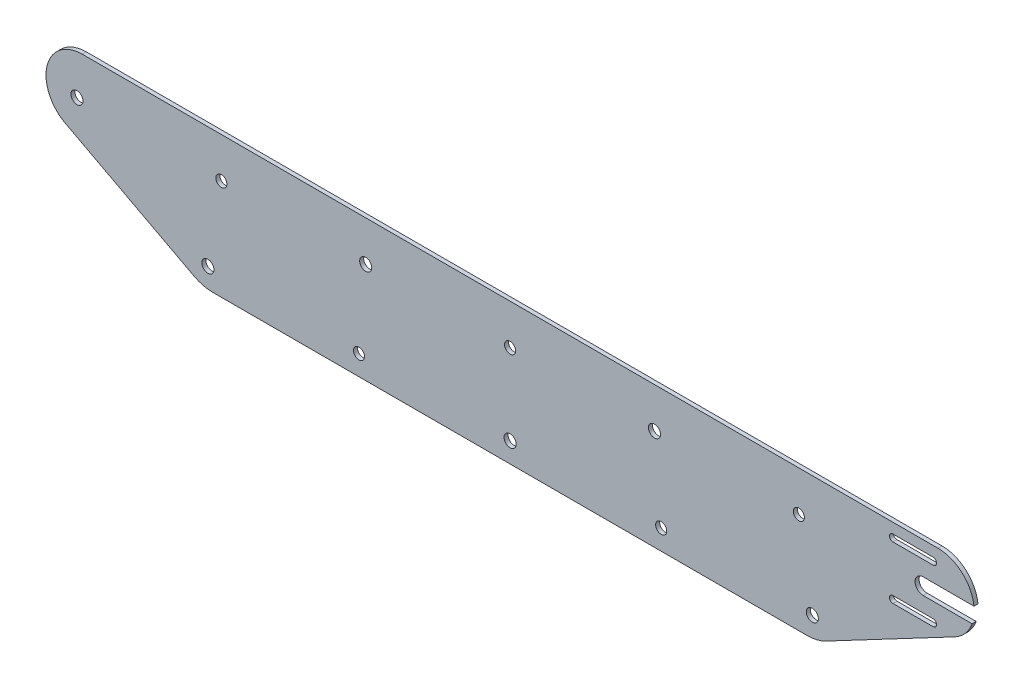
ISO-10303-21;
HEADER;
FILE_DESCRIPTION(('STEP AP214'),'2;1');
FILE_NAME('part.step','',(''),(''),'','','');
FILE_SCHEMA(('AUTOMOTIVE_DESIGN { 1 0 10303 214 1 1 1 1 }'));
ENDSEC;
DATA;
#1=APPLICATION_CONTEXT('core data for automotive mechanical design processes');
#2=APPLICATION_PROTOCOL_DEFINITION('international standard','automotive_design',2000,#1);
#3=PRODUCT_CONTEXT('',#1,'mechanical');
#4=PRODUCT('Part','Part','',(#3));
#5=PRODUCT_RELATED_PRODUCT_CATEGORY('part','',(#4));
#6=PRODUCT_DEFINITION_FORMATION('','',#4);
#7=PRODUCT_DEFINITION_CONTEXT('part definition',#1,'design');
#8=PRODUCT_DEFINITION('design','',#6,#7);
#9=PRODUCT_DEFINITION_SHAPE('','',#8);
#10=(LENGTH_UNIT() NAMED_UNIT(*) SI_UNIT(.MILLI.,.METRE.));
#11=(NAMED_UNIT(*) PLANE_ANGLE_UNIT() SI_UNIT($,.RADIAN.));
#12=(NAMED_UNIT(*) SI_UNIT($,.STERADIAN.) SOLID_ANGLE_UNIT());
#13=UNCERTAINTY_MEASURE_WITH_UNIT(LENGTH_MEASURE(1.E-05),#10,'distance_accuracy_value','');
#14=(GEOMETRIC_REPRESENTATION_CONTEXT(3) GLOBAL_UNCERTAINTY_ASSIGNED_CONTEXT((#13)) GLOBAL_UNIT_ASSIGNED_CONTEXT((#10,
#11,#12)) REPRESENTATION_CONTEXT('',''));
#15=CARTESIAN_POINT('',(0.,0.,0.));
#16=DIRECTION('',(0.,0.,1.));
#17=DIRECTION('',(1.,0.,0.));
#18=AXIS2_PLACEMENT_3D('',#15,#16,#17);
#19=CARTESIAN_POINT('',(0.,0.,2.));
#20=DIRECTION('',(0.,0.,-1.));
#21=DIRECTION('',(-1.,0.,0.));
#22=AXIS2_PLACEMENT_3D('',#19,#20,#21);
#23=PLANE('',#22);
#24=CARTESIAN_POINT('',(-74.9999999999999,-20.,2.));
#25=DIRECTION('',(0.,0.,1.));
#26=DIRECTION('',(1.,0.,0.));
#27=AXIS2_PLACEMENT_3D('',#24,#25,#26);
#28=CIRCLE('',#27,2.75);
#29=CARTESIAN_POINT('',(-72.2499999999999,-20.,2.));
#30=VERTEX_POINT('',#29);
#31=EDGE_CURVE('E754',#30,#30,#28,.T.);
#32=ORIENTED_EDGE('',*,*,#31,.F.);
#33=EDGE_LOOP('',(#32));
#34=FACE_BOUND('',#33,.T.);
#35=CARTESIAN_POINT('',(-143.333333333333,20.,2.));
#36=DIRECTION('',(0.,0.,-1.));
#37=DIRECTION('',(-1.,0.,0.));
#38=AXIS2_PLACEMENT_3D('',#35,#36,#37);
#39=CIRCLE('',#38,2.74999999999997);
#40=CARTESIAN_POINT('',(-146.083333333333,20.,2.));
#41=VERTEX_POINT('',#40);
#42=EDGE_CURVE('E760',#41,#41,#39,.T.);
#43=ORIENTED_EDGE('',*,*,#42,.T.);
#44=EDGE_LOOP('',(#43));
#45=FACE_BOUND('',#44,.T.);
#46=CARTESIAN_POINT('',(0.,20.,2.));
#47=DIRECTION('',(0.,0.,-1.));
#48=DIRECTION('',(-1.,0.,0.));
#49=AXIS2_PLACEMENT_3D('',#46,#47,#48);
#50=CIRCLE('',#49,2.74999999999999);
#51=CARTESIAN_POINT('',(-2.75000000000003,20.,2.));
#52=VERTEX_POINT('',#51);
#53=EDGE_CURVE('E766',#52,#52,#50,.T.);
#54=ORIENTED_EDGE('',*,*,#53,.T.);
#55=EDGE_LOOP('',(#54));
#56=FACE_BOUND('',#55,.T.);
#57=CARTESIAN_POINT('',(143.333333333333,20.,2.));
#58=DIRECTION('',(0.,0.,-1.));
#59=DIRECTION('',(-1.,0.,0.));
#60=AXIS2_PLACEMENT_3D('',#57,#58,#59);
#61=CIRCLE('',#60,2.74999999999997);
#62=CARTESIAN_POINT('',(140.583333333333,20.,2.));
#63=VERTEX_POINT('',#62);
#64=EDGE_CURVE('E251',#63,#63,#61,.T.);
#65=ORIENTED_EDGE('',*,*,#64,.T.);
#66=EDGE_LOOP('',(#65));
#67=FACE_BOUND('',#66,.T.);
#68=DIRECTION('',(-1.,0.,0.));
#69=VECTOR('',#68,1.);
#70=CARTESIAN_POINT('',(0.,5.07124344467712,2.));
#71=LINE('',#70,#69);
#72=CARTESIAN_POINT('',(210.,5.07124344467712,2.));
#73=VERTEX_POINT('',#72);
#74=CARTESIAN_POINT('',(190.,5.07124344467712,2.));
#75=VERTEX_POINT('',#74);
#76=EDGE_CURVE('E264',#73,#75,#71,.T.);
#77=ORIENTED_EDGE('',*,*,#76,.T.);
#78=CARTESIAN_POINT('',(190.,6.7712434446771,2.));
#79=DIRECTION('',(0.,0.,-1.));
#80=DIRECTION('',(-1.,0.,0.));
#81=AXIS2_PLACEMENT_3D('',#78,#79,#80);
#82=CIRCLE('',#81,1.69999999999998);
#83=CARTESIAN_POINT('',(190.,8.47124344467708,2.));
#84=VERTEX_POINT('',#83);
#85=EDGE_CURVE('E243',#84,#75,#82,.F.);
#86=ORIENTED_EDGE('',*,*,#85,.F.);
#87=DIRECTION('',(1.,0.,0.));
#88=VECTOR('',#87,1.);
#89=CARTESIAN_POINT('',(0.,8.47124344467722,2.));
#90=LINE('',#89,#88);
#91=CARTESIAN_POINT('',(210.,8.47124344467707,2.));
#92=VERTEX_POINT('',#91);
#93=EDGE_CURVE('E233',#84,#92,#90,.T.);
#94=ORIENTED_EDGE('',*,*,#93,.T.);
#95=CARTESIAN_POINT('',(210.,6.7712434446771,2.));
#96=DIRECTION('',(0.,0.,-1.));
#97=DIRECTION('',(-1.,0.,0.));
#98=AXIS2_PLACEMENT_3D('',#95,#96,#97);
#99=CIRCLE('',#98,1.69999999999998);
#100=EDGE_CURVE('E261',#92,#73,#99,.T.);
#101=ORIENTED_EDGE('',*,*,#100,.T.);
#102=EDGE_LOOP('',(#77,#86,#94,#101));
#103=FACE_BOUND('',#102,.T.);
#104=DIRECTION('',(1.,0.,0.));
#105=VECTOR('',#104,1.);
#106=CARTESIAN_POINT('',(0.,34.928756555323,2.));
#107=LINE('',#106,#105);
#108=CARTESIAN_POINT('',(190.,34.9287565553229,2.));
#109=VERTEX_POINT('',#108);
#110=CARTESIAN_POINT('',(210.,34.9287565553229,2.));
#111=VERTEX_POINT('',#110);
#112=EDGE_CURVE('E286',#109,#111,#107,.T.);
#113=ORIENTED_EDGE('',*,*,#112,.T.);
#114=CARTESIAN_POINT('',(210.,33.2287565553229,2.));
#115=DIRECTION('',(0.,0.,-1.));
#116=DIRECTION('',(-1.,0.,0.));
#117=AXIS2_PLACEMENT_3D('',#114,#115,#116);
#118=CIRCLE('',#117,1.69999999999997);
#119=CARTESIAN_POINT('',(210.,31.5287565553229,2.));
#120=VERTEX_POINT('',#119);
#121=EDGE_CURVE('E274',#111,#120,#118,.T.);
#122=ORIENTED_EDGE('',*,*,#121,.T.);
#123=DIRECTION('',(-1.,0.,0.));
#124=VECTOR('',#123,1.);
#125=CARTESIAN_POINT('',(0.,31.5287565553229,2.));
#126=LINE('',#125,#124);
#127=CARTESIAN_POINT('',(190.,31.5287565553229,2.));
#128=VERTEX_POINT('',#127);
#129=EDGE_CURVE('E289',#120,#128,#126,.T.);
#130=ORIENTED_EDGE('',*,*,#129,.T.);
#131=CARTESIAN_POINT('',(190.,33.2287565553229,2.));
#132=DIRECTION('',(0.,0.,-1.));
#133=DIRECTION('',(-1.,0.,0.));
#134=AXIS2_PLACEMENT_3D('',#131,#132,#133);
#135=CIRCLE('',#134,1.69999999999998);
#136=EDGE_CURVE('E284',#109,#128,#135,.F.);
#137=ORIENTED_EDGE('',*,*,#136,.F.);
#138=EDGE_LOOP('',(#113,#122,#130,#137));
#139=FACE_BOUND('',#138,.T.);
#140=DIRECTION('',(1.,0.,0.));
#141=VECTOR('',#140,1.);
#142=CARTESIAN_POINT('',(0.,16.0000000000001,2.));
#143=LINE('',#142,#141);
#144=CARTESIAN_POINT('',(205.,16.,2.));
#145=VERTEX_POINT('',#144);
#146=CARTESIAN_POINT('',(229.334149785652,16.,2.));
#147=VERTEX_POINT('',#146);
#148=EDGE_CURVE('E303',#145,#147,#143,.T.);
#149=ORIENTED_EDGE('',*,*,#148,.F.);
#150=CARTESIAN_POINT('',(205.,20.,2.));
#151=DIRECTION('',(0.,0.,-1.));
#152=DIRECTION('',(-1.,0.,0.));
#153=AXIS2_PLACEMENT_3D('',#150,#151,#152);
#154=CIRCLE('',#153,4.00000000000001);
#155=CARTESIAN_POINT('',(205.,24.,2.));
#156=VERTEX_POINT('',#155);
#157=EDGE_CURVE('E305',#156,#145,#154,.F.);
#158=ORIENTED_EDGE('',*,*,#157,.F.);
#159=DIRECTION('',(1.,0.,0.));
#160=VECTOR('',#159,1.);
#161=CARTESIAN_POINT('',(0.,24.,2.));
#162=LINE('',#161,#160);
#163=CARTESIAN_POINT('',(230.252130857173,24.,2.));
#164=VERTEX_POINT('',#163);
#165=EDGE_CURVE('E307',#156,#164,#162,.T.);
#166=ORIENTED_EDGE('',*,*,#165,.T.);
#167=CARTESIAN_POINT('',(212.363587037175,22.0000000000002,2.));
#168=DIRECTION('',(0.,0.,-1.));
#169=DIRECTION('',(-1.,0.,0.));
#170=AXIS2_PLACEMENT_3D('',#167,#168,#169);
#171=CIRCLE('',#170,18.);
#172=CARTESIAN_POINT('',(212.363587037175,40.0000000000001,2.));
#173=VERTEX_POINT('',#172);
#174=EDGE_CURVE('E398',#164,#173,#171,.F.);
#175=ORIENTED_EDGE('',*,*,#174,.T.);
#176=DIRECTION('',(-1.,0.,0.));
#177=VECTOR('',#176,1.);
#178=CARTESIAN_POINT('',(150.,40.0000000000001,2.));
#179=LINE('',#178,#177);
#180=CARTESIAN_POINT('',(-212.363587037174,40.0000000000004,2.));
#181=VERTEX_POINT('',#180);
#182=EDGE_CURVE('E369',#173,#181,#179,.T.);
#183=ORIENTED_EDGE('',*,*,#182,.T.);
#184=CARTESIAN_POINT('',(-212.363587037174,22.,2.));
#185=DIRECTION('',(0.,0.,-1.));
#186=DIRECTION('',(-1.,0.,0.));
#187=AXIS2_PLACEMENT_3D('',#184,#185,#186);
#188=CIRCLE('',#187,18.);
#189=CARTESIAN_POINT('',(-220.772782979187,6.08505659423048,2.));
#190=VERTEX_POINT('',#189);
#191=EDGE_CURVE('E396',#181,#190,#188,.F.);
#192=ORIENTED_EDGE('',*,*,#191,.T.);
#193=DIRECTION('',(0.884163522542753,-0.467177552334003,0.));
#194=VECTOR('',#193,1.);
#195=CARTESIAN_POINT('',(-284.958991581617,40.,2.));
#196=LINE('',#195,#194);
#197=CARTESIAN_POINT('',(-156.864055255872,-27.6832704508551,2.));
#198=VERTEX_POINT('',#197);
#199=EDGE_CURVE('E361',#190,#198,#196,.T.);
#200=ORIENTED_EDGE('',*,*,#199,.T.);
#201=CARTESIAN_POINT('',(-147.520504209191,-10.,2.));
#202=DIRECTION('',(0.,0.,-1.));
#203=DIRECTION('',(-1.,0.,0.));
#204=AXIS2_PLACEMENT_3D('',#201,#202,#203);
#205=CIRCLE('',#204,20.);
#206=CARTESIAN_POINT('',(-147.520504209191,-30.,2.));
#207=VERTEX_POINT('',#206);
#208=EDGE_CURVE('E93',#198,#207,#205,.F.);
#209=ORIENTED_EDGE('',*,*,#208,.T.);
#210=DIRECTION('',(1.,0.,0.));
#211=VECTOR('',#210,1.);
#212=CARTESIAN_POINT('',(-152.479495790809,-30.,2.));
#213=LINE('',#212,#211);
#214=CARTESIAN_POINT('',(147.520504209191,-30.,2.));
#215=VERTEX_POINT('',#214);
#216=EDGE_CURVE('E364',#207,#215,#213,.T.);
#217=ORIENTED_EDGE('',*,*,#216,.T.);
#218=CARTESIAN_POINT('',(147.520504209191,-9.99999999999999,2.));
#219=DIRECTION('',(0.,0.,-1.));
#220=DIRECTION('',(-1.,0.,0.));
#221=AXIS2_PLACEMENT_3D('',#218,#219,#220);
#222=CIRCLE('',#221,20.);
#223=CARTESIAN_POINT('',(156.864055255872,-27.6832704508551,2.));
#224=VERTEX_POINT('',#223);
#225=EDGE_CURVE('E108',#215,#224,#222,.F.);
#226=ORIENTED_EDGE('',*,*,#225,.T.);
#227=DIRECTION('',(0.884163522542753,0.467177552334003,0.));
#228=VECTOR('',#227,1.);
#229=CARTESIAN_POINT('',(284.958991581617,40.,2.));
#230=LINE('',#229,#228);
#231=CARTESIAN_POINT('',(220.772782979187,6.08505659423059,2.));
#232=VERTEX_POINT('',#231);
#233=EDGE_CURVE('E367',#224,#232,#230,.T.);
#234=ORIENTED_EDGE('',*,*,#233,.T.);
#235=EDGE_CURVE('E399',#232,#147,#171,.F.);
#236=ORIENTED_EDGE('',*,*,#235,.T.);
#237=EDGE_LOOP('',(#149,#158,#166,#175,#183,#192,#200,#209,#217,#226,#234,#236));
#238=FACE_BOUND('',#237,.T.);
#239=CARTESIAN_POINT('',(0.,-20.,2.));
#240=DIRECTION('',(0.,0.,1.));
#241=DIRECTION('',(1.,0.,0.));
#242=AXIS2_PLACEMENT_3D('',#239,#240,#241);
#243=CIRCLE('',#242,3.);
#244=CARTESIAN_POINT('',(3.00000000000003,-20.,2.));
#245=VERTEX_POINT('',#244);
#246=EDGE_CURVE('E355',#245,#245,#243,.T.);
#247=ORIENTED_EDGE('',*,*,#246,.F.);
#248=EDGE_LOOP('',(#247));
#249=FACE_BOUND('',#248,.T.);
#250=CARTESIAN_POINT('',(-215.,20.,2.));
#251=DIRECTION('',(0.,0.,1.));
#252=DIRECTION('',(1.,0.,0.));
#253=AXIS2_PLACEMENT_3D('',#250,#251,#252);
#254=CIRCLE('',#253,2.99999999999999);
#255=CARTESIAN_POINT('',(-212.,20.,2.));
#256=VERTEX_POINT('',#255);
#257=EDGE_CURVE('E349',#256,#256,#254,.T.);
#258=ORIENTED_EDGE('',*,*,#257,.F.);
#259=EDGE_LOOP('',(#258));
#260=FACE_BOUND('',#259,.T.);
#261=CARTESIAN_POINT('',(-150.,-20.,2.));
#262=DIRECTION('',(0.,0.,1.));
#263=DIRECTION('',(1.,0.,0.));
#264=AXIS2_PLACEMENT_3D('',#261,#262,#263);
#265=CIRCLE('',#264,2.99999999999999);
#266=CARTESIAN_POINT('',(-147.,-20.,2.));
#267=VERTEX_POINT('',#266);
#268=EDGE_CURVE('E343',#267,#267,#265,.T.);
#269=ORIENTED_EDGE('',*,*,#268,.F.);
#270=EDGE_LOOP('',(#269));
#271=FACE_BOUND('',#270,.T.);
#272=CARTESIAN_POINT('',(150.,-20.,2.));
#273=DIRECTION('',(0.,0.,1.));
#274=DIRECTION('',(1.,0.,0.));
#275=AXIS2_PLACEMENT_3D('',#272,#273,#274);
#276=CIRCLE('',#275,2.99999999999999);
#277=CARTESIAN_POINT('',(153.,-20.,2.));
#278=VERTEX_POINT('',#277);
#279=EDGE_CURVE('E337',#278,#278,#276,.T.);
#280=ORIENTED_EDGE('',*,*,#279,.F.);
#281=EDGE_LOOP('',(#280));
#282=FACE_BOUND('',#281,.T.);
#283=CARTESIAN_POINT('',(-71.6666666666667,20.,2.));
#284=DIRECTION('',(0.,0.,1.));
#285=DIRECTION('',(1.,0.,0.));
#286=AXIS2_PLACEMENT_3D('',#283,#284,#285);
#287=CIRCLE('',#286,3.00000000000001);
#288=CARTESIAN_POINT('',(-68.6666666666667,20.,2.));
#289=VERTEX_POINT('',#288);
#290=EDGE_CURVE('E331',#289,#289,#287,.T.);
#291=ORIENTED_EDGE('',*,*,#290,.F.);
#292=EDGE_LOOP('',(#291));
#293=FACE_BOUND('',#292,.T.);
#294=CARTESIAN_POINT('',(71.6666666666666,20.,2.));
#295=DIRECTION('',(0.,0.,1.));
#296=DIRECTION('',(1.,0.,0.));
#297=AXIS2_PLACEMENT_3D('',#294,#295,#296);
#298=CIRCLE('',#297,3.00000000000001);
#299=CARTESIAN_POINT('',(74.6666666666666,20.,2.));
#300=VERTEX_POINT('',#299);
#301=EDGE_CURVE('E325',#300,#300,#298,.T.);
#302=ORIENTED_EDGE('',*,*,#301,.F.);
#303=EDGE_LOOP('',(#302));
#304=FACE_BOUND('',#303,.T.);
#305=CARTESIAN_POINT('',(75.,-20.,2.));
#306=DIRECTION('',(0.,0.,1.));
#307=DIRECTION('',(1.,0.,0.));
#308=AXIS2_PLACEMENT_3D('',#305,#306,#307);
#309=CIRCLE('',#308,2.75);
#310=CARTESIAN_POINT('',(77.75,-20.,2.));
#311=VERTEX_POINT('',#310);
#312=EDGE_CURVE('E745',#311,#311,#309,.T.);
#313=ORIENTED_EDGE('',*,*,#312,.F.);
#314=EDGE_LOOP('',(#313));
#315=FACE_BOUND('',#314,.T.);
#316=ADVANCED_FACE('F85',(#34,#45,#56,#67,#103,#139,#238,#249,#260,#271,#282,#293,#304,#315),
#23,.F.);
#317=CARTESIAN_POINT('',(0.,0.,0.));
#318=DIRECTION('',(0.,0.,-1.));
#319=DIRECTION('',(-1.,0.,0.));
#320=AXIS2_PLACEMENT_3D('',#317,#318,#319);
#321=PLANE('',#320);
#322=CARTESIAN_POINT('',(-74.9999999999999,-20.,0.));
#323=DIRECTION('',(0.,0.,1.));
#324=DIRECTION('',(1.,0.,0.));
#325=AXIS2_PLACEMENT_3D('',#322,#323,#324);
#326=CIRCLE('',#325,2.75);
#327=CARTESIAN_POINT('',(-72.2499999999999,-20.,0.));
#328=VERTEX_POINT('',#327);
#329=EDGE_CURVE('E748',#328,#328,#326,.T.);
#330=ORIENTED_EDGE('',*,*,#329,.T.);
#331=EDGE_LOOP('',(#330));
#332=FACE_BOUND('',#331,.T.);
#333=CARTESIAN_POINT('',(71.6666666666666,20.,0.));
#334=DIRECTION('',(0.,0.,1.));
#335=DIRECTION('',(1.,0.,0.));
#336=AXIS2_PLACEMENT_3D('',#333,#334,#335);
#337=CIRCLE('',#336,3.00000000000001);
#338=CARTESIAN_POINT('',(74.6666666666666,20.,0.));
#339=VERTEX_POINT('',#338);
#340=EDGE_CURVE('E319',#339,#339,#337,.T.);
#341=ORIENTED_EDGE('',*,*,#340,.T.);
#342=EDGE_LOOP('',(#341));
#343=FACE_BOUND('',#342,.T.);
#344=CARTESIAN_POINT('',(-150.,-20.,0.));
#345=DIRECTION('',(0.,0.,1.));
#346=DIRECTION('',(1.,0.,0.));
#347=AXIS2_PLACEMENT_3D('',#344,#345,#346);
#348=CIRCLE('',#347,2.99999999999999);
#349=CARTESIAN_POINT('',(-147.,-20.,0.));
#350=VERTEX_POINT('',#349);
#351=EDGE_CURVE('E340',#350,#350,#348,.T.);
#352=ORIENTED_EDGE('',*,*,#351,.T.);
#353=EDGE_LOOP('',(#352));
#354=FACE_BOUND('',#353,.T.);
#355=CARTESIAN_POINT('',(0.,-20.,0.));
#356=DIRECTION('',(0.,0.,1.));
#357=DIRECTION('',(1.,0.,0.));
#358=AXIS2_PLACEMENT_3D('',#355,#356,#357);
#359=CIRCLE('',#358,3.);
#360=CARTESIAN_POINT('',(3.00000000000003,-20.,0.));
#361=VERTEX_POINT('',#360);
#362=EDGE_CURVE('E352',#361,#361,#359,.T.);
#363=ORIENTED_EDGE('',*,*,#362,.T.);
#364=EDGE_LOOP('',(#363));
#365=FACE_BOUND('',#364,.T.);
#366=CARTESIAN_POINT('',(-215.,20.,0.));
#367=DIRECTION('',(0.,0.,1.));
#368=DIRECTION('',(1.,0.,0.));
#369=AXIS2_PLACEMENT_3D('',#366,#367,#368);
#370=CIRCLE('',#369,2.99999999999999);
#371=CARTESIAN_POINT('',(-212.,20.,0.));
#372=VERTEX_POINT('',#371);
#373=EDGE_CURVE('E346',#372,#372,#370,.T.);
#374=ORIENTED_EDGE('',*,*,#373,.T.);
#375=EDGE_LOOP('',(#374));
#376=FACE_BOUND('',#375,.T.);
#377=CARTESIAN_POINT('',(150.,-20.,0.));
#378=DIRECTION('',(0.,0.,1.));
#379=DIRECTION('',(1.,0.,0.));
#380=AXIS2_PLACEMENT_3D('',#377,#378,#379);
#381=CIRCLE('',#380,2.99999999999999);
#382=CARTESIAN_POINT('',(153.,-20.,0.));
#383=VERTEX_POINT('',#382);
#384=EDGE_CURVE('E334',#383,#383,#381,.T.);
#385=ORIENTED_EDGE('',*,*,#384,.T.);
#386=EDGE_LOOP('',(#385));
#387=FACE_BOUND('',#386,.T.);
#388=CARTESIAN_POINT('',(-71.6666666666667,20.,0.));
#389=DIRECTION('',(0.,0.,1.));
#390=DIRECTION('',(1.,0.,0.));
#391=AXIS2_PLACEMENT_3D('',#388,#389,#390);
#392=CIRCLE('',#391,3.00000000000001);
#393=CARTESIAN_POINT('',(-68.6666666666667,20.,0.));
#394=VERTEX_POINT('',#393);
#395=EDGE_CURVE('E328',#394,#394,#392,.T.);
#396=ORIENTED_EDGE('',*,*,#395,.T.);
#397=EDGE_LOOP('',(#396));
#398=FACE_BOUND('',#397,.T.);
#399=CARTESIAN_POINT('',(205.,20.,0.));
#400=DIRECTION('',(0.,0.,-1.));
#401=DIRECTION('',(-1.,0.,0.));
#402=AXIS2_PLACEMENT_3D('',#399,#400,#401);
#403=CIRCLE('',#402,4.00000000000001);
#404=CARTESIAN_POINT('',(205.,24.,0.));
#405=VERTEX_POINT('',#404);
#406=CARTESIAN_POINT('',(205.,16.,0.));
#407=VERTEX_POINT('',#406);
#408=EDGE_CURVE('E313',#405,#407,#403,.F.);
#409=ORIENTED_EDGE('',*,*,#408,.T.);
#410=DIRECTION('',(1.,0.,0.));
#411=VECTOR('',#410,1.);
#412=CARTESIAN_POINT('',(0.,16.0000000000001,0.));
#413=LINE('',#412,#411);
#414=CARTESIAN_POINT('',(229.334149785652,16.,0.));
#415=VERTEX_POINT('',#414);
#416=EDGE_CURVE('E301',#407,#415,#413,.T.);
#417=ORIENTED_EDGE('',*,*,#416,.T.);
#418=CARTESIAN_POINT('',(212.363587037175,22.0000000000002,0.));
#419=DIRECTION('',(0.,0.,-1.));
#420=DIRECTION('',(-1.,0.,0.));
#421=AXIS2_PLACEMENT_3D('',#418,#419,#420);
#422=CIRCLE('',#421,18.);
#423=CARTESIAN_POINT('',(220.772782979187,6.08505659423059,0.));
#424=VERTEX_POINT('',#423);
#425=EDGE_CURVE('E389',#415,#424,#422,.T.);
#426=ORIENTED_EDGE('',*,*,#425,.T.);
#427=DIRECTION('',(0.884163522542753,0.467177552334003,0.));
#428=VECTOR('',#427,1.);
#429=CARTESIAN_POINT('',(284.958991581617,40.,0.));
#430=LINE('',#429,#428);
#431=CARTESIAN_POINT('',(156.864055255872,-27.6832704508551,0.));
#432=VERTEX_POINT('',#431);
#433=EDGE_CURVE('E378',#432,#424,#430,.T.);
#434=ORIENTED_EDGE('',*,*,#433,.F.);
#435=CARTESIAN_POINT('',(147.520504209191,-9.99999999999999,0.));
#436=DIRECTION('',(0.,0.,-1.));
#437=DIRECTION('',(-1.,0.,0.));
#438=AXIS2_PLACEMENT_3D('',#435,#436,#437);
#439=CIRCLE('',#438,20.);
#440=CARTESIAN_POINT('',(147.520504209191,-30.,0.));
#441=VERTEX_POINT('',#440);
#442=EDGE_CURVE('E410',#432,#441,#439,.T.);
#443=ORIENTED_EDGE('',*,*,#442,.T.);
#444=DIRECTION('',(1.,0.,0.));
#445=VECTOR('',#444,1.);
#446=CARTESIAN_POINT('',(-152.479495790809,-30.,0.));
#447=LINE('',#446,#445);
#448=CARTESIAN_POINT('',(-147.520504209191,-30.,0.));
#449=VERTEX_POINT('',#448);
#450=EDGE_CURVE('E375',#449,#441,#447,.T.);
#451=ORIENTED_EDGE('',*,*,#450,.F.);
#452=CARTESIAN_POINT('',(-147.520504209191,-10.,0.));
#453=DIRECTION('',(0.,0.,-1.));
#454=DIRECTION('',(-1.,0.,0.));
#455=AXIS2_PLACEMENT_3D('',#452,#453,#454);
#456=CIRCLE('',#455,20.);
#457=CARTESIAN_POINT('',(-156.864055255872,-27.6832704508551,0.));
#458=VERTEX_POINT('',#457);
#459=EDGE_CURVE('E412',#449,#458,#456,.T.);
#460=ORIENTED_EDGE('',*,*,#459,.T.);
#461=DIRECTION('',(0.884163522542753,-0.467177552334003,0.));
#462=VECTOR('',#461,1.);
#463=CARTESIAN_POINT('',(-284.958991581617,40.,0.));
#464=LINE('',#463,#462);
#465=CARTESIAN_POINT('',(-220.772782979187,6.08505659423048,0.));
#466=VERTEX_POINT('',#465);
#467=EDGE_CURVE('E358',#466,#458,#464,.T.);
#468=ORIENTED_EDGE('',*,*,#467,.F.);
#469=CARTESIAN_POINT('',(-212.363587037174,22.,0.));
#470=DIRECTION('',(0.,0.,-1.));
#471=DIRECTION('',(-1.,0.,0.));
#472=AXIS2_PLACEMENT_3D('',#469,#470,#471);
#473=CIRCLE('',#472,18.);
#474=CARTESIAN_POINT('',(-212.363587037174,40.,0.));
#475=VERTEX_POINT('',#474);
#476=EDGE_CURVE('E387',#466,#475,#473,.T.);
#477=ORIENTED_EDGE('',*,*,#476,.T.);
#478=DIRECTION('',(-1.,0.,0.));
#479=VECTOR('',#478,1.);
#480=CARTESIAN_POINT('',(-284.958991581617,40.,0.));
#481=LINE('',#480,#479);
#482=CARTESIAN_POINT('',(212.363587037175,40.0000000000002,0.));
#483=VERTEX_POINT('',#482);
#484=EDGE_CURVE('E365',#483,#475,#481,.T.);
#485=ORIENTED_EDGE('',*,*,#484,.F.);
#486=CARTESIAN_POINT('',(230.252130857173,24.,0.));
#487=VERTEX_POINT('',#486);
#488=EDGE_CURVE('E390',#483,#487,#422,.T.);
#489=ORIENTED_EDGE('',*,*,#488,.T.);
#490=DIRECTION('',(1.,0.,0.));
#491=VECTOR('',#490,1.);
#492=CARTESIAN_POINT('',(0.,24.,0.));
#493=LINE('',#492,#491);
#494=EDGE_CURVE('E100',#405,#487,#493,.T.);
#495=ORIENTED_EDGE('',*,*,#494,.F.);
#496=EDGE_LOOP('',(#409,#417,#426,#434,#443,#451,#460,#468,#477,#485,#489,#495));
#497=FACE_BOUND('',#496,.T.);
#498=CARTESIAN_POINT('',(210.,33.2287565553229,0.));
#499=DIRECTION('',(0.,0.,-1.));
#500=DIRECTION('',(-1.,0.,0.));
#501=AXIS2_PLACEMENT_3D('',#498,#499,#500);
#502=CIRCLE('',#501,1.69999999999997);
#503=CARTESIAN_POINT('',(210.,34.9287565553229,0.));
#504=VERTEX_POINT('',#503);
#505=CARTESIAN_POINT('',(210.,31.5287565553229,0.));
#506=VERTEX_POINT('',#505);
#507=EDGE_CURVE('E278',#504,#506,#502,.T.);
#508=ORIENTED_EDGE('',*,*,#507,.F.);
#509=DIRECTION('',(1.,0.,0.));
#510=VECTOR('',#509,1.);
#511=CARTESIAN_POINT('',(0.,34.928756555323,0.));
#512=LINE('',#511,#510);
#513=CARTESIAN_POINT('',(190.,34.9287565553229,0.));
#514=VERTEX_POINT('',#513);
#515=EDGE_CURVE('E295',#514,#504,#512,.T.);
#516=ORIENTED_EDGE('',*,*,#515,.F.);
#517=CARTESIAN_POINT('',(190.,33.2287565553229,0.));
#518=DIRECTION('',(0.,0.,-1.));
#519=DIRECTION('',(-1.,0.,0.));
#520=AXIS2_PLACEMENT_3D('',#517,#518,#519);
#521=CIRCLE('',#520,1.69999999999998);
#522=CARTESIAN_POINT('',(190.,31.5287565553229,0.));
#523=VERTEX_POINT('',#522);
#524=EDGE_CURVE('E281',#514,#523,#521,.F.);
#525=ORIENTED_EDGE('',*,*,#524,.T.);
#526=DIRECTION('',(-1.,0.,0.));
#527=VECTOR('',#526,1.);
#528=CARTESIAN_POINT('',(0.,31.5287565553229,0.));
#529=LINE('',#528,#527);
#530=EDGE_CURVE('E287',#506,#523,#529,.T.);
#531=ORIENTED_EDGE('',*,*,#530,.F.);
#532=EDGE_LOOP('',(#508,#516,#525,#531));
#533=FACE_BOUND('',#532,.T.);
#534=CARTESIAN_POINT('',(190.,6.7712434446771,0.));
#535=DIRECTION('',(0.,0.,-1.));
#536=DIRECTION('',(-1.,0.,0.));
#537=AXIS2_PLACEMENT_3D('',#534,#535,#536);
#538=CIRCLE('',#537,1.69999999999998);
#539=CARTESIAN_POINT('',(190.,8.47124344467708,0.));
#540=VERTEX_POINT('',#539);
#541=CARTESIAN_POINT('',(190.,5.07124344467712,0.));
#542=VERTEX_POINT('',#541);
#543=EDGE_CURVE('E241',#540,#542,#538,.F.);
#544=ORIENTED_EDGE('',*,*,#543,.T.);
#545=DIRECTION('',(-1.,0.,0.));
#546=VECTOR('',#545,1.);
#547=CARTESIAN_POINT('',(0.,5.07124344467712,0.));
#548=LINE('',#547,#546);
#549=CARTESIAN_POINT('',(210.,5.07124344467712,0.));
#550=VERTEX_POINT('',#549);
#551=EDGE_CURVE('E223',#550,#542,#548,.T.);
#552=ORIENTED_EDGE('',*,*,#551,.F.);
#553=CARTESIAN_POINT('',(210.,6.7712434446771,0.));
#554=DIRECTION('',(0.,0.,-1.));
#555=DIRECTION('',(-1.,0.,0.));
#556=AXIS2_PLACEMENT_3D('',#553,#554,#555);
#557=CIRCLE('',#556,1.69999999999998);
#558=CARTESIAN_POINT('',(210.,8.47124344467707,0.));
#559=VERTEX_POINT('',#558);
#560=EDGE_CURVE('E234',#559,#550,#557,.T.);
#561=ORIENTED_EDGE('',*,*,#560,.F.);
#562=DIRECTION('',(1.,0.,0.));
#563=VECTOR('',#562,1.);
#564=CARTESIAN_POINT('',(0.,8.47124344467722,0.));
#565=LINE('',#564,#563);
#566=EDGE_CURVE('E249',#540,#559,#565,.T.);
#567=ORIENTED_EDGE('',*,*,#566,.F.);
#568=EDGE_LOOP('',(#544,#552,#561,#567));
#569=FACE_BOUND('',#568,.T.);
#570=CARTESIAN_POINT('',(143.333333333333,20.,0.));
#571=DIRECTION('',(0.,0.,-1.));
#572=DIRECTION('',(-1.,0.,0.));
#573=AXIS2_PLACEMENT_3D('',#570,#571,#572);
#574=CIRCLE('',#573,2.74999999999997);
#575=CARTESIAN_POINT('',(140.583333333333,20.,0.));
#576=VERTEX_POINT('',#575);
#577=EDGE_CURVE('E255',#576,#576,#574,.T.);
#578=ORIENTED_EDGE('',*,*,#577,.F.);
#579=EDGE_LOOP('',(#578));
#580=FACE_BOUND('',#579,.T.);
#581=CARTESIAN_POINT('',(0.,20.,0.));
#582=DIRECTION('',(0.,0.,-1.));
#583=DIRECTION('',(-1.,0.,0.));
#584=AXIS2_PLACEMENT_3D('',#581,#582,#583);
#585=CIRCLE('',#584,2.74999999999999);
#586=CARTESIAN_POINT('',(-2.75000000000003,20.,0.));
#587=VERTEX_POINT('',#586);
#588=EDGE_CURVE('E763',#587,#587,#585,.T.);
#589=ORIENTED_EDGE('',*,*,#588,.F.);
#590=EDGE_LOOP('',(#589));
#591=FACE_BOUND('',#590,.T.);
#592=CARTESIAN_POINT('',(-143.333333333333,20.,0.));
#593=DIRECTION('',(0.,0.,-1.));
#594=DIRECTION('',(-1.,0.,0.));
#595=AXIS2_PLACEMENT_3D('',#592,#593,#594);
#596=CIRCLE('',#595,2.74999999999997);
#597=CARTESIAN_POINT('',(-146.083333333333,20.,0.));
#598=VERTEX_POINT('',#597);
#599=EDGE_CURVE('E751',#598,#598,#596,.T.);
#600=ORIENTED_EDGE('',*,*,#599,.F.);
#601=EDGE_LOOP('',(#600));
#602=FACE_BOUND('',#601,.T.);
#603=CARTESIAN_POINT('',(75.,-20.,0.));
#604=DIRECTION('',(0.,0.,1.));
#605=DIRECTION('',(1.,0.,0.));
#606=AXIS2_PLACEMENT_3D('',#603,#604,#605);
#607=CIRCLE('',#606,2.75);
#608=CARTESIAN_POINT('',(77.75,-20.,0.));
#609=VERTEX_POINT('',#608);
#610=EDGE_CURVE('E747',#609,#609,#607,.T.);
#611=ORIENTED_EDGE('',*,*,#610,.T.);
#612=EDGE_LOOP('',(#611));
#613=FACE_BOUND('',#612,.T.);
#614=ADVANCED_FACE('F246',(#332,#343,#354,#365,#376,#387,#398,#497,#533,#569,#580,#591,#602,
#613),#321,.T.);
#615=CARTESIAN_POINT('',(212.363587037175,22.0000000000002,2.));
#616=DIRECTION('',(0.,0.,-1.));
#617=DIRECTION('',(-1.,0.,0.));
#618=AXIS2_PLACEMENT_3D('',#615,#616,#617);
#619=CYLINDRICAL_SURFACE('',#618,18.);
#620=ORIENTED_EDGE('',*,*,#425,.F.);
#621=DIRECTION('',(0.,0.,-1.));
#622=VECTOR('',#621,1.);
#623=CARTESIAN_POINT('',(229.334149785652,16.,2.));
#624=LINE('',#623,#622);
#625=EDGE_CURVE('E317',#147,#415,#624,.T.);
#626=ORIENTED_EDGE('',*,*,#625,.F.);
#627=ORIENTED_EDGE('',*,*,#235,.F.);
#628=DIRECTION('',(0.,0.,-1.));
#629=VECTOR('',#628,1.);
#630=CARTESIAN_POINT('',(220.772782979187,6.08505659423059,2.));
#631=LINE('',#630,#629);
#632=EDGE_CURVE('E393',#424,#232,#631,.F.);
#633=ORIENTED_EDGE('',*,*,#632,.F.);
#634=EDGE_LOOP('',(#620,#626,#627,#633));
#635=FACE_BOUND('',#634,.T.);
#636=ADVANCED_FACE('F460',(#635),#619,.T.);
#637=CARTESIAN_POINT('',(-284.958991581617,40.,2.));
#638=DIRECTION('',(0.467177552334003,0.884163522542753,0.));
#639=DIRECTION('',(-0.884163522542753,0.467177552334003,0.));
#640=AXIS2_PLACEMENT_3D('',#637,#638,#639);
#641=PLANE('',#640);
#642=ORIENTED_EDGE('',*,*,#467,.T.);
#643=DIRECTION('',(0.,0.,-1.));
#644=VECTOR('',#643,1.);
#645=CARTESIAN_POINT('',(-156.864055255872,-27.6832704508551,2.));
#646=LINE('',#645,#644);
#647=EDGE_CURVE('E414',#458,#198,#646,.F.);
#648=ORIENTED_EDGE('',*,*,#647,.T.);
#649=ORIENTED_EDGE('',*,*,#199,.F.);
#650=DIRECTION('',(0.,0.,-1.));
#651=VECTOR('',#650,1.);
#652=CARTESIAN_POINT('',(-220.772782979187,6.08505659423048,2.));
#653=LINE('',#652,#651);
#654=EDGE_CURVE('E402',#190,#466,#653,.T.);
#655=ORIENTED_EDGE('',*,*,#654,.T.);
#656=EDGE_LOOP('',(#642,#648,#649,#655));
#657=FACE_BOUND('',#656,.T.);
#658=ADVANCED_FACE('F433',(#657),#641,.F.);
#659=CARTESIAN_POINT('',(-152.479495790809,-30.,2.));
#660=DIRECTION('',(0.,1.,0.));
#661=DIRECTION('',(0.,0.,1.));
#662=AXIS2_PLACEMENT_3D('',#659,#660,#661);
#663=PLANE('',#662);
#664=ORIENTED_EDGE('',*,*,#216,.F.);
#665=DIRECTION('',(0.,0.,-1.));
#666=VECTOR('',#665,1.);
#667=CARTESIAN_POINT('',(-147.520504209191,-30.,2.));
#668=LINE('',#667,#666);
#669=EDGE_CURVE('E407',#207,#449,#668,.T.);
#670=ORIENTED_EDGE('',*,*,#669,.T.);
#671=ORIENTED_EDGE('',*,*,#450,.T.);
#672=DIRECTION('',(0.,0.,-1.));
#673=VECTOR('',#672,1.);
#674=CARTESIAN_POINT('',(147.520504209191,-30.,2.));
#675=LINE('',#674,#673);
#676=EDGE_CURVE('E405',#441,#215,#675,.F.);
#677=ORIENTED_EDGE('',*,*,#676,.T.);
#678=EDGE_LOOP('',(#664,#670,#671,#677));
#679=FACE_BOUND('',#678,.T.);
#680=ADVANCED_FACE('F425',(#679),#663,.F.);
#681=CARTESIAN_POINT('',(284.958991581617,40.,2.));
#682=DIRECTION('',(-0.467177552334003,0.884163522542753,0.));
#683=DIRECTION('',(-0.884163522542753,-0.467177552334003,0.));
#684=AXIS2_PLACEMENT_3D('',#681,#682,#683);
#685=PLANE('',#684);
#686=ORIENTED_EDGE('',*,*,#233,.F.);
#687=DIRECTION('',(0.,0.,-1.));
#688=VECTOR('',#687,1.);
#689=CARTESIAN_POINT('',(156.864055255872,-27.6832704508551,2.));
#690=LINE('',#689,#688);
#691=EDGE_CURVE('E12',#224,#432,#690,.T.);
#692=ORIENTED_EDGE('',*,*,#691,.T.);
#693=ORIENTED_EDGE('',*,*,#433,.T.);
#694=ORIENTED_EDGE('',*,*,#632,.T.);
#695=EDGE_LOOP('',(#686,#692,#693,#694));
#696=FACE_BOUND('',#695,.T.);
#697=ADVANCED_FACE('F464',(#696),#685,.F.);
#698=CARTESIAN_POINT('',(-284.958991581617,40.,2.));
#699=DIRECTION('',(0.,-1.,0.));
#700=DIRECTION('',(1.,0.,0.));
#701=AXIS2_PLACEMENT_3D('',#698,#699,#700);
#702=PLANE('',#701);
#703=ORIENTED_EDGE('',*,*,#182,.F.);
#704=DIRECTION('',(0.,0.,-1.));
#705=VECTOR('',#704,1.);
#706=CARTESIAN_POINT('',(212.363587037175,40.0000000000002,2.));
#707=LINE('',#706,#705);
#708=EDGE_CURVE('E384',#173,#483,#707,.T.);
#709=ORIENTED_EDGE('',*,*,#708,.T.);
#710=ORIENTED_EDGE('',*,*,#484,.T.);
#711=DIRECTION('',(0.,0.,-1.));
#712=VECTOR('',#711,1.);
#713=CARTESIAN_POINT('',(-212.363587037174,40.,2.));
#714=LINE('',#713,#712);
#715=EDGE_CURVE('E372',#475,#181,#714,.F.);
#716=ORIENTED_EDGE('',*,*,#715,.T.);
#717=EDGE_LOOP('',(#703,#709,#710,#716));
#718=FACE_BOUND('',#717,.T.);
#719=ADVANCED_FACE('F442',(#718),#702,.F.);
#720=CARTESIAN_POINT('',(0.,-20.,2.));
#721=DIRECTION('',(0.,0.,-1.));
#722=DIRECTION('',(-1.,0.,0.));
#723=AXIS2_PLACEMENT_3D('',#720,#721,#722);
#724=CYLINDRICAL_SURFACE('',#723,3.);
#725=ORIENTED_EDGE('',*,*,#246,.T.);
#726=EDGE_LOOP('',(#725));
#727=FACE_BOUND('',#726,.T.);
#728=ORIENTED_EDGE('',*,*,#362,.F.);
#729=EDGE_LOOP('',(#728));
#730=FACE_BOUND('',#729,.T.);
#731=ADVANCED_FACE('F485',(#727,#730),#724,.F.);
#732=CARTESIAN_POINT('',(-215.,20.,2.));
#733=DIRECTION('',(0.,0.,-1.));
#734=DIRECTION('',(-1.,0.,0.));
#735=AXIS2_PLACEMENT_3D('',#732,#733,#734);
#736=CYLINDRICAL_SURFACE('',#735,2.99999999999999);
#737=ORIENTED_EDGE('',*,*,#257,.T.);
#738=EDGE_LOOP('',(#737));
#739=FACE_BOUND('',#738,.T.);
#740=ORIENTED_EDGE('',*,*,#373,.F.);
#741=EDGE_LOOP('',(#740));
#742=FACE_BOUND('',#741,.T.);
#743=ADVANCED_FACE('F715',(#739,#742),#736,.F.);
#744=CARTESIAN_POINT('',(-150.,-20.,2.));
#745=DIRECTION('',(0.,0.,-1.));
#746=DIRECTION('',(-1.,0.,0.));
#747=AXIS2_PLACEMENT_3D('',#744,#745,#746);
#748=CYLINDRICAL_SURFACE('',#747,2.99999999999999);
#749=ORIENTED_EDGE('',*,*,#268,.T.);
#750=EDGE_LOOP('',(#749));
#751=FACE_BOUND('',#750,.T.);
#752=ORIENTED_EDGE('',*,*,#351,.F.);
#753=EDGE_LOOP('',(#752));
#754=FACE_BOUND('',#753,.T.);
#755=ADVANCED_FACE('F712',(#751,#754),#748,.F.);
#756=CARTESIAN_POINT('',(150.,-20.,2.));
#757=DIRECTION('',(0.,0.,-1.));
#758=DIRECTION('',(-1.,0.,0.));
#759=AXIS2_PLACEMENT_3D('',#756,#757,#758);
#760=CYLINDRICAL_SURFACE('',#759,2.99999999999999);
#761=ORIENTED_EDGE('',*,*,#279,.T.);
#762=EDGE_LOOP('',(#761));
#763=FACE_BOUND('',#762,.T.);
#764=ORIENTED_EDGE('',*,*,#384,.F.);
#765=EDGE_LOOP('',(#764));
#766=FACE_BOUND('',#765,.T.);
#767=ADVANCED_FACE('F708',(#763,#766),#760,.F.);
#768=CARTESIAN_POINT('',(-71.6666666666667,20.,2.));
#769=DIRECTION('',(0.,0.,-1.));
#770=DIRECTION('',(-1.,0.,0.));
#771=AXIS2_PLACEMENT_3D('',#768,#769,#770);
#772=CYLINDRICAL_SURFACE('',#771,3.00000000000001);
#773=ORIENTED_EDGE('',*,*,#290,.T.);
#774=EDGE_LOOP('',(#773));
#775=FACE_BOUND('',#774,.T.);
#776=ORIENTED_EDGE('',*,*,#395,.F.);
#777=EDGE_LOOP('',(#776));
#778=FACE_BOUND('',#777,.T.);
#779=ADVANCED_FACE('F704',(#775,#778),#772,.F.);
#780=CARTESIAN_POINT('',(71.6666666666666,20.,2.));
#781=DIRECTION('',(0.,0.,-1.));
#782=DIRECTION('',(-1.,0.,0.));
#783=AXIS2_PLACEMENT_3D('',#780,#781,#782);
#784=CYLINDRICAL_SURFACE('',#783,3.00000000000001);
#785=ORIENTED_EDGE('',*,*,#301,.T.);
#786=EDGE_LOOP('',(#785));
#787=FACE_BOUND('',#786,.T.);
#788=ORIENTED_EDGE('',*,*,#340,.F.);
#789=EDGE_LOOP('',(#788));
#790=FACE_BOUND('',#789,.T.);
#791=ADVANCED_FACE('F498',(#787,#790),#784,.F.);
#792=DIRECTION('',(0.,0.,-1.));
#793=VECTOR('',#792,1.);
#794=CARTESIAN_POINT('',(230.252130857173,24.,2.));
#795=LINE('',#794,#793);
#796=EDGE_CURVE('E320',#164,#487,#795,.T.);
#797=ORIENTED_EDGE('',*,*,#796,.T.);
#798=ORIENTED_EDGE('',*,*,#488,.F.);
#799=ORIENTED_EDGE('',*,*,#708,.F.);
#800=ORIENTED_EDGE('',*,*,#174,.F.);
#801=EDGE_LOOP('',(#797,#798,#799,#800));
#802=FACE_BOUND('',#801,.T.);
#803=ADVANCED_FACE('F446',(#802),#619,.T.);
#804=CARTESIAN_POINT('',(-212.363587037174,22.,2.));
#805=DIRECTION('',(0.,0.,-1.));
#806=DIRECTION('',(-1.,0.,0.));
#807=AXIS2_PLACEMENT_3D('',#804,#805,#806);
#808=CYLINDRICAL_SURFACE('',#807,18.);
#809=ORIENTED_EDGE('',*,*,#191,.F.);
#810=ORIENTED_EDGE('',*,*,#715,.F.);
#811=ORIENTED_EDGE('',*,*,#476,.F.);
#812=ORIENTED_EDGE('',*,*,#654,.F.);
#813=EDGE_LOOP('',(#809,#810,#811,#812));
#814=FACE_BOUND('',#813,.T.);
#815=ADVANCED_FACE('F437',(#814),#808,.T.);
#816=CARTESIAN_POINT('',(-147.520504209191,-10.,2.));
#817=DIRECTION('',(0.,0.,-1.));
#818=DIRECTION('',(-1.,0.,0.));
#819=AXIS2_PLACEMENT_3D('',#816,#817,#818);
#820=CYLINDRICAL_SURFACE('',#819,20.);
#821=ORIENTED_EDGE('',*,*,#208,.F.);
#822=ORIENTED_EDGE('',*,*,#647,.F.);
#823=ORIENTED_EDGE('',*,*,#459,.F.);
#824=ORIENTED_EDGE('',*,*,#669,.F.);
#825=EDGE_LOOP('',(#821,#822,#823,#824));
#826=FACE_BOUND('',#825,.T.);
#827=ADVANCED_FACE('F428',(#826),#820,.T.);
#828=CARTESIAN_POINT('',(147.520504209191,-9.99999999999999,2.));
#829=DIRECTION('',(0.,0.,-1.));
#830=DIRECTION('',(-1.,0.,0.));
#831=AXIS2_PLACEMENT_3D('',#828,#829,#830);
#832=CYLINDRICAL_SURFACE('',#831,20.);
#833=ORIENTED_EDGE('',*,*,#225,.F.);
#834=ORIENTED_EDGE('',*,*,#676,.F.);
#835=ORIENTED_EDGE('',*,*,#442,.F.);
#836=ORIENTED_EDGE('',*,*,#691,.F.);
#837=EDGE_LOOP('',(#833,#834,#835,#836));
#838=FACE_BOUND('',#837,.T.);
#839=ADVANCED_FACE('F87',(#838),#832,.T.);
#840=CARTESIAN_POINT('',(0.,16.0000000000001,2.));
#841=DIRECTION('',(0.,1.,0.));
#842=DIRECTION('',(-1.,0.,0.));
#843=AXIS2_PLACEMENT_3D('',#840,#841,#842);
#844=PLANE('',#843);
#845=ORIENTED_EDGE('',*,*,#416,.F.);
#846=DIRECTION('',(0.,0.,-1.));
#847=VECTOR('',#846,1.);
#848=CARTESIAN_POINT('',(205.,16.,2.));
#849=LINE('',#848,#847);
#850=EDGE_CURVE('E310',#145,#407,#849,.T.);
#851=ORIENTED_EDGE('',*,*,#850,.F.);
#852=ORIENTED_EDGE('',*,*,#148,.T.);
#853=ORIENTED_EDGE('',*,*,#625,.T.);
#854=EDGE_LOOP('',(#845,#851,#852,#853));
#855=FACE_BOUND('',#854,.T.);
#856=ADVANCED_FACE('F456',(#855),#844,.T.);
#857=CARTESIAN_POINT('',(0.,24.,2.));
#858=DIRECTION('',(0.,1.,0.));
#859=DIRECTION('',(0.,0.,1.));
#860=AXIS2_PLACEMENT_3D('',#857,#858,#859);
#861=PLANE('',#860);
#862=ORIENTED_EDGE('',*,*,#494,.T.);
#863=ORIENTED_EDGE('',*,*,#796,.F.);
#864=ORIENTED_EDGE('',*,*,#165,.F.);
#865=DIRECTION('',(0.,0.,-1.));
#866=VECTOR('',#865,1.);
#867=CARTESIAN_POINT('',(205.,24.,2.));
#868=LINE('',#867,#866);
#869=EDGE_CURVE('E322',#156,#405,#868,.T.);
#870=ORIENTED_EDGE('',*,*,#869,.T.);
#871=EDGE_LOOP('',(#862,#863,#864,#870));
#872=FACE_BOUND('',#871,.T.);
#873=ADVANCED_FACE('F472',(#872),#861,.F.);
#874=CARTESIAN_POINT('',(205.,20.,2.));
#875=DIRECTION('',(0.,0.,-1.));
#876=DIRECTION('',(-1.,0.,0.));
#877=AXIS2_PLACEMENT_3D('',#874,#875,#876);
#878=CYLINDRICAL_SURFACE('',#877,4.00000000000001);
#879=ORIENTED_EDGE('',*,*,#408,.F.);
#880=ORIENTED_EDGE('',*,*,#869,.F.);
#881=ORIENTED_EDGE('',*,*,#157,.T.);
#882=ORIENTED_EDGE('',*,*,#850,.T.);
#883=EDGE_LOOP('',(#879,#880,#881,#882));
#884=FACE_BOUND('',#883,.T.);
#885=ADVANCED_FACE('F451',(#884),#878,.F.);
#886=CARTESIAN_POINT('',(190.,33.2287565553229,2.));
#887=DIRECTION('',(0.,0.,-1.));
#888=DIRECTION('',(-1.,0.,0.));
#889=AXIS2_PLACEMENT_3D('',#886,#887,#888);
#890=CYLINDRICAL_SURFACE('',#889,1.69999999999998);
#891=ORIENTED_EDGE('',*,*,#524,.F.);
#892=DIRECTION('',(0.,0.,-1.));
#893=VECTOR('',#892,1.);
#894=CARTESIAN_POINT('',(190.,34.9287565553229,2.));
#895=LINE('',#894,#893);
#896=EDGE_CURVE('E292',#109,#514,#895,.T.);
#897=ORIENTED_EDGE('',*,*,#896,.F.);
#898=ORIENTED_EDGE('',*,*,#136,.T.);
#899=DIRECTION('',(0.,0.,-1.));
#900=VECTOR('',#899,1.);
#901=CARTESIAN_POINT('',(190.,31.5287565553229,2.));
#902=LINE('',#901,#900);
#903=EDGE_CURVE('E299',#128,#523,#902,.T.);
#904=ORIENTED_EDGE('',*,*,#903,.T.);
#905=EDGE_LOOP('',(#891,#897,#898,#904));
#906=FACE_BOUND('',#905,.T.);
#907=ADVANCED_FACE('F557',(#906),#890,.F.);
#908=CARTESIAN_POINT('',(0.,31.5287565553229,2.));
#909=DIRECTION('',(0.,-1.,0.));
#910=DIRECTION('',(0.,0.,-1.));
#911=AXIS2_PLACEMENT_3D('',#908,#909,#910);
#912=PLANE('',#911);
#913=ORIENTED_EDGE('',*,*,#530,.T.);
#914=ORIENTED_EDGE('',*,*,#903,.F.);
#915=ORIENTED_EDGE('',*,*,#129,.F.);
#916=DIRECTION('',(0.,0.,-1.));
#917=VECTOR('',#916,1.);
#918=CARTESIAN_POINT('',(210.,31.5287565553229,2.));
#919=LINE('',#918,#917);
#920=EDGE_CURVE('E275',#120,#506,#919,.T.);
#921=ORIENTED_EDGE('',*,*,#920,.T.);
#922=EDGE_LOOP('',(#913,#914,#915,#921));
#923=FACE_BOUND('',#922,.T.);
#924=ADVANCED_FACE('F566',(#923),#912,.F.);
#925=CARTESIAN_POINT('',(0.,34.928756555323,2.));
#926=DIRECTION('',(0.,1.,0.));
#927=DIRECTION('',(-1.,0.,0.));
#928=AXIS2_PLACEMENT_3D('',#925,#926,#927);
#929=PLANE('',#928);
#930=ORIENTED_EDGE('',*,*,#515,.T.);
#931=DIRECTION('',(0.,0.,-1.));
#932=VECTOR('',#931,1.);
#933=CARTESIAN_POINT('',(210.,34.9287565553229,2.));
#934=LINE('',#933,#932);
#935=EDGE_CURVE('E270',#111,#504,#934,.T.);
#936=ORIENTED_EDGE('',*,*,#935,.F.);
#937=ORIENTED_EDGE('',*,*,#112,.F.);
#938=ORIENTED_EDGE('',*,*,#896,.T.);
#939=EDGE_LOOP('',(#930,#936,#937,#938));
#940=FACE_BOUND('',#939,.T.);
#941=ADVANCED_FACE('F577',(#940),#929,.F.);
#942=CARTESIAN_POINT('',(210.,33.2287565553229,2.));
#943=DIRECTION('',(0.,0.,-1.));
#944=DIRECTION('',(-1.,0.,0.));
#945=AXIS2_PLACEMENT_3D('',#942,#943,#944);
#946=CYLINDRICAL_SURFACE('',#945,1.69999999999997);
#947=ORIENTED_EDGE('',*,*,#507,.T.);
#948=ORIENTED_EDGE('',*,*,#920,.F.);
#949=ORIENTED_EDGE('',*,*,#121,.F.);
#950=ORIENTED_EDGE('',*,*,#935,.T.);
#951=EDGE_LOOP('',(#947,#948,#949,#950));
#952=FACE_BOUND('',#951,.T.);
#953=ADVANCED_FACE('F588',(#952),#946,.F.);
#954=CARTESIAN_POINT('',(0.,8.47124344467722,2.));
#955=DIRECTION('',(0.,1.,0.));
#956=DIRECTION('',(-1.,0.,0.));
#957=AXIS2_PLACEMENT_3D('',#954,#955,#956);
#958=PLANE('',#957);
#959=ORIENTED_EDGE('',*,*,#566,.T.);
#960=DIRECTION('',(0.,0.,-1.));
#961=VECTOR('',#960,1.);
#962=CARTESIAN_POINT('',(210.,8.47124344467707,2.));
#963=LINE('',#962,#961);
#964=EDGE_CURVE('E266',#92,#559,#963,.T.);
#965=ORIENTED_EDGE('',*,*,#964,.F.);
#966=ORIENTED_EDGE('',*,*,#93,.F.);
#967=DIRECTION('',(0.,0.,-1.));
#968=VECTOR('',#967,1.);
#969=CARTESIAN_POINT('',(190.,8.47124344467708,2.));
#970=LINE('',#969,#968);
#971=EDGE_CURVE('E244',#84,#540,#970,.T.);
#972=ORIENTED_EDGE('',*,*,#971,.T.);
#973=EDGE_LOOP('',(#959,#965,#966,#972));
#974=FACE_BOUND('',#973,.T.);
#975=ADVANCED_FACE('F598',(#974),#958,.F.);
#976=CARTESIAN_POINT('',(0.,5.07124344467712,2.));
#977=DIRECTION('',(0.,-1.,0.));
#978=DIRECTION('',(0.,0.,-1.));
#979=AXIS2_PLACEMENT_3D('',#976,#977,#978);
#980=PLANE('',#979);
#981=ORIENTED_EDGE('',*,*,#551,.T.);
#982=DIRECTION('',(0.,0.,-1.));
#983=VECTOR('',#982,1.);
#984=CARTESIAN_POINT('',(190.,5.07124344467712,2.));
#985=LINE('',#984,#983);
#986=EDGE_CURVE('E227',#75,#542,#985,.T.);
#987=ORIENTED_EDGE('',*,*,#986,.F.);
#988=ORIENTED_EDGE('',*,*,#76,.F.);
#989=DIRECTION('',(0.,0.,-1.));
#990=VECTOR('',#989,1.);
#991=CARTESIAN_POINT('',(210.,5.07124344467712,2.));
#992=LINE('',#991,#990);
#993=EDGE_CURVE('E228',#73,#550,#992,.T.);
#994=ORIENTED_EDGE('',*,*,#993,.T.);
#995=EDGE_LOOP('',(#981,#987,#988,#994));
#996=FACE_BOUND('',#995,.T.);
#997=ADVANCED_FACE('F225',(#996),#980,.F.);
#998=CARTESIAN_POINT('',(210.,6.7712434446771,2.));
#999=DIRECTION('',(0.,0.,-1.));
#1000=DIRECTION('',(-1.,0.,0.));
#1001=AXIS2_PLACEMENT_3D('',#998,#999,#1000);
#1002=CYLINDRICAL_SURFACE('',#1001,1.69999999999998);
#1003=ORIENTED_EDGE('',*,*,#560,.T.);
#1004=ORIENTED_EDGE('',*,*,#993,.F.);
#1005=ORIENTED_EDGE('',*,*,#100,.F.);
#1006=ORIENTED_EDGE('',*,*,#964,.T.);
#1007=EDGE_LOOP('',(#1003,#1004,#1005,#1006));
#1008=FACE_BOUND('',#1007,.T.);
#1009=ADVANCED_FACE('F619',(#1008),#1002,.F.);
#1010=CARTESIAN_POINT('',(190.,6.7712434446771,2.));
#1011=DIRECTION('',(0.,0.,-1.));
#1012=DIRECTION('',(-1.,0.,0.));
#1013=AXIS2_PLACEMENT_3D('',#1010,#1011,#1012);
#1014=CYLINDRICAL_SURFACE('',#1013,1.69999999999998);
#1015=ORIENTED_EDGE('',*,*,#543,.F.);
#1016=ORIENTED_EDGE('',*,*,#971,.F.);
#1017=ORIENTED_EDGE('',*,*,#85,.T.);
#1018=ORIENTED_EDGE('',*,*,#986,.T.);
#1019=EDGE_LOOP('',(#1015,#1016,#1017,#1018));
#1020=FACE_BOUND('',#1019,.T.);
#1021=ADVANCED_FACE('F239',(#1020),#1014,.F.);
#1022=CARTESIAN_POINT('',(143.333333333333,20.,0.));
#1023=DIRECTION('',(0.,0.,-1.));
#1024=DIRECTION('',(-1.,0.,0.));
#1025=AXIS2_PLACEMENT_3D('',#1022,#1023,#1024);
#1026=CYLINDRICAL_SURFACE('',#1025,2.74999999999997);
#1027=ORIENTED_EDGE('',*,*,#64,.F.);
#1028=EDGE_LOOP('',(#1027));
#1029=FACE_BOUND('',#1028,.T.);
#1030=ORIENTED_EDGE('',*,*,#577,.T.);
#1031=EDGE_LOOP('',(#1030));
#1032=FACE_BOUND('',#1031,.T.);
#1033=ADVANCED_FACE('F637',(#1029,#1032),#1026,.F.);
#1034=CARTESIAN_POINT('',(0.,20.,0.));
#1035=DIRECTION('',(0.,0.,-1.));
#1036=DIRECTION('',(-1.,0.,0.));
#1037=AXIS2_PLACEMENT_3D('',#1034,#1035,#1036);
#1038=CYLINDRICAL_SURFACE('',#1037,2.74999999999999);
#1039=ORIENTED_EDGE('',*,*,#53,.F.);
#1040=EDGE_LOOP('',(#1039));
#1041=FACE_BOUND('',#1040,.T.);
#1042=ORIENTED_EDGE('',*,*,#588,.T.);
#1043=EDGE_LOOP('',(#1042));
#1044=FACE_BOUND('',#1043,.T.);
#1045=ADVANCED_FACE('F646',(#1041,#1044),#1038,.F.);
#1046=CARTESIAN_POINT('',(-143.333333333333,20.,0.));
#1047=DIRECTION('',(0.,0.,-1.));
#1048=DIRECTION('',(-1.,0.,0.));
#1049=AXIS2_PLACEMENT_3D('',#1046,#1047,#1048);
#1050=CYLINDRICAL_SURFACE('',#1049,2.74999999999997);
#1051=ORIENTED_EDGE('',*,*,#42,.F.);
#1052=EDGE_LOOP('',(#1051));
#1053=FACE_BOUND('',#1052,.T.);
#1054=ORIENTED_EDGE('',*,*,#599,.T.);
#1055=EDGE_LOOP('',(#1054));
#1056=FACE_BOUND('',#1055,.T.);
#1057=ADVANCED_FACE('F656',(#1053,#1056),#1050,.F.);
#1058=CARTESIAN_POINT('',(75.,-20.,2.));
#1059=DIRECTION('',(0.,0.,1.));
#1060=DIRECTION('',(1.,0.,0.));
#1061=AXIS2_PLACEMENT_3D('',#1058,#1059,#1060);
#1062=CYLINDRICAL_SURFACE('',#1061,2.75);
#1063=ORIENTED_EDGE('',*,*,#610,.F.);
#1064=EDGE_LOOP('',(#1063));
#1065=FACE_BOUND('',#1064,.T.);
#1066=ORIENTED_EDGE('',*,*,#312,.T.);
#1067=EDGE_LOOP('',(#1066));
#1068=FACE_BOUND('',#1067,.T.);
#1069=ADVANCED_FACE('F665',(#1065,#1068),#1062,.F.);
#1070=CARTESIAN_POINT('',(-74.9999999999999,-20.,2.));
#1071=DIRECTION('',(0.,0.,1.));
#1072=DIRECTION('',(1.,0.,0.));
#1073=AXIS2_PLACEMENT_3D('',#1070,#1071,#1072);
#1074=CYLINDRICAL_SURFACE('',#1073,2.75);
#1075=ORIENTED_EDGE('',*,*,#329,.F.);
#1076=EDGE_LOOP('',(#1075));
#1077=FACE_BOUND('',#1076,.T.);
#1078=ORIENTED_EDGE('',*,*,#31,.T.);
#1079=EDGE_LOOP('',(#1078));
#1080=FACE_BOUND('',#1079,.T.);
#1081=ADVANCED_FACE('F686',(#1077,#1080),#1074,.F.);
#1082=CLOSED_SHELL('',(#316,#614,#636,#658,#680,#697,#719,#731,#743,#755,#767,#779,#791,#803,
#815,#827,#839,#856,#873,#885,#907,#924,#941,#953,#975,#997,#1009,#1021,#1033,#1045,#1057,#1069,#1081));
#1083=MANIFOLD_SOLID_BREP('B2',#1082);
#1084=ADVANCED_BREP_SHAPE_REPRESENTATION('',(#18,#1083),#14);
#1085=SHAPE_DEFINITION_REPRESENTATION(#9,#1084);
ENDSEC;
END-ISO-10303-21;
